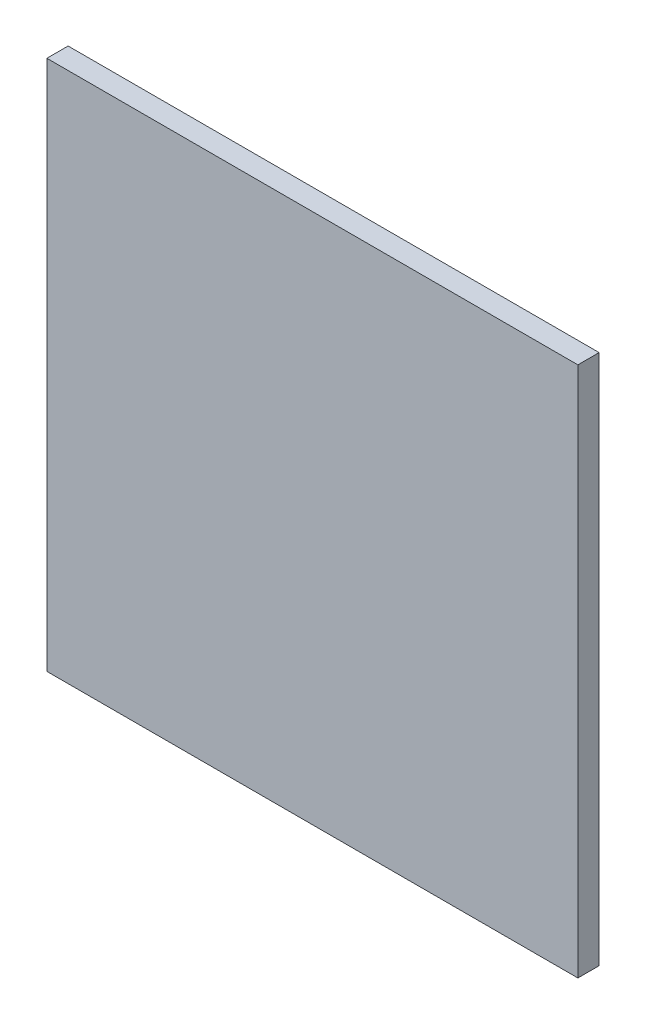
ISO-10303-21;
HEADER;
FILE_DESCRIPTION(('STEP AP214'),'2;1');
FILE_NAME('part.step','',(''),(''),'','','');
FILE_SCHEMA(('AUTOMOTIVE_DESIGN { 1 0 10303 214 1 1 1 1 }'));
ENDSEC;
DATA;
#1=APPLICATION_CONTEXT('core data for automotive mechanical design processes');
#2=APPLICATION_PROTOCOL_DEFINITION('international standard','automotive_design',2000,#1);
#3=PRODUCT_CONTEXT('',#1,'mechanical');
#4=PRODUCT('Part','Part','',(#3));
#5=PRODUCT_RELATED_PRODUCT_CATEGORY('part','',(#4));
#6=PRODUCT_DEFINITION_FORMATION('','',#4);
#7=PRODUCT_DEFINITION_CONTEXT('part definition',#1,'design');
#8=PRODUCT_DEFINITION('design','',#6,#7);
#9=PRODUCT_DEFINITION_SHAPE('','',#8);
#10=(LENGTH_UNIT() NAMED_UNIT(*) SI_UNIT(.MILLI.,.METRE.));
#11=(NAMED_UNIT(*) PLANE_ANGLE_UNIT() SI_UNIT($,.RADIAN.));
#12=(NAMED_UNIT(*) SI_UNIT($,.STERADIAN.) SOLID_ANGLE_UNIT());
#13=UNCERTAINTY_MEASURE_WITH_UNIT(LENGTH_MEASURE(1.E-05),#10,'distance_accuracy_value','');
#14=(GEOMETRIC_REPRESENTATION_CONTEXT(3) GLOBAL_UNCERTAINTY_ASSIGNED_CONTEXT((#13)) GLOBAL_UNIT_ASSIGNED_CONTEXT((#10,
#11,#12)) REPRESENTATION_CONTEXT('',''));
#15=CARTESIAN_POINT('',(0.,0.,0.));
#16=DIRECTION('',(0.,0.,1.));
#17=DIRECTION('',(1.,0.,0.));
#18=AXIS2_PLACEMENT_3D('',#15,#16,#17);
#19=CARTESIAN_POINT('',(37.5,-37.5,3.));
#20=DIRECTION('',(-1.,0.,0.));
#21=DIRECTION('',(0.,0.,1.));
#22=AXIS2_PLACEMENT_3D('',#19,#20,#21);
#23=PLANE('',#22);
#24=DIRECTION('',(0.,1.,0.));
#25=VECTOR('',#24,1.);
#26=CARTESIAN_POINT('',(37.5,-37.5,0.));
#27=LINE('',#26,#25);
#28=CARTESIAN_POINT('',(37.5,-37.5,0.));
#29=VERTEX_POINT('',#28);
#30=CARTESIAN_POINT('',(37.5,37.5,0.));
#31=VERTEX_POINT('',#30);
#32=EDGE_CURVE('E96',#29,#31,#27,.T.);
#33=ORIENTED_EDGE('',*,*,#32,.T.);
#34=DIRECTION('',(0.,0.,-1.));
#35=VECTOR('',#34,1.);
#36=CARTESIAN_POINT('',(37.5,37.5,3.));
#37=LINE('',#36,#35);
#38=CARTESIAN_POINT('',(37.5,37.5,3.));
#39=VERTEX_POINT('',#38);
#40=EDGE_CURVE('E11',#39,#31,#37,.T.);
#41=ORIENTED_EDGE('',*,*,#40,.F.);
#42=DIRECTION('',(0.,1.,0.));
#43=VECTOR('',#42,1.);
#44=CARTESIAN_POINT('',(37.5,-37.5,3.));
#45=LINE('',#44,#43);
#46=CARTESIAN_POINT('',(37.5,-37.5,3.));
#47=VERTEX_POINT('',#46);
#48=EDGE_CURVE('E84',#47,#39,#45,.T.);
#49=ORIENTED_EDGE('',*,*,#48,.F.);
#50=DIRECTION('',(0.,0.,-1.));
#51=VECTOR('',#50,1.);
#52=CARTESIAN_POINT('',(37.5,-37.5,3.));
#53=LINE('',#52,#51);
#54=EDGE_CURVE('E92',#47,#29,#53,.T.);
#55=ORIENTED_EDGE('',*,*,#54,.T.);
#56=EDGE_LOOP('',(#33,#41,#49,#55));
#57=FACE_BOUND('',#56,.T.);
#58=ADVANCED_FACE('F33',(#57),#23,.F.);
#59=CARTESIAN_POINT('',(-37.5,37.5,3.));
#60=DIRECTION('',(0.,-1.,0.));
#61=DIRECTION('',(0.,0.,-1.));
#62=AXIS2_PLACEMENT_3D('',#59,#60,#61);
#63=PLANE('',#62);
#64=DIRECTION('',(-1.,0.,0.));
#65=VECTOR('',#64,1.);
#66=CARTESIAN_POINT('',(-37.5,37.5,0.));
#67=LINE('',#66,#65);
#68=CARTESIAN_POINT('',(-37.5,37.5,0.));
#69=VERTEX_POINT('',#68);
#70=EDGE_CURVE('E88',#31,#69,#67,.T.);
#71=ORIENTED_EDGE('',*,*,#70,.T.);
#72=DIRECTION('',(0.,0.,-1.));
#73=VECTOR('',#72,1.);
#74=CARTESIAN_POINT('',(-37.5,37.5,3.));
#75=LINE('',#74,#73);
#76=CARTESIAN_POINT('',(-37.5,37.5,3.));
#77=VERTEX_POINT('',#76);
#78=EDGE_CURVE('E41',#77,#69,#75,.T.);
#79=ORIENTED_EDGE('',*,*,#78,.F.);
#80=DIRECTION('',(-1.,0.,0.));
#81=VECTOR('',#80,1.);
#82=CARTESIAN_POINT('',(-37.5,37.5,3.));
#83=LINE('',#82,#81);
#84=EDGE_CURVE('E79',#39,#77,#83,.T.);
#85=ORIENTED_EDGE('',*,*,#84,.F.);
#86=ORIENTED_EDGE('',*,*,#40,.T.);
#87=EDGE_LOOP('',(#71,#79,#85,#86));
#88=FACE_BOUND('',#87,.T.);
#89=ADVANCED_FACE('F87',(#88),#63,.F.);
#90=CARTESIAN_POINT('',(-37.5,-37.5,3.));
#91=DIRECTION('',(1.,0.,0.));
#92=DIRECTION('',(0.,0.,-1.));
#93=AXIS2_PLACEMENT_3D('',#90,#91,#92);
#94=PLANE('',#93);
#95=DIRECTION('',(0.,-1.,0.));
#96=VECTOR('',#95,1.);
#97=CARTESIAN_POINT('',(-37.5,-37.5,0.));
#98=LINE('',#97,#96);
#99=CARTESIAN_POINT('',(-37.5,-37.5,0.));
#100=VERTEX_POINT('',#99);
#101=EDGE_CURVE('E66',#69,#100,#98,.T.);
#102=ORIENTED_EDGE('',*,*,#101,.T.);
#103=DIRECTION('',(0.,0.,-1.));
#104=VECTOR('',#103,1.);
#105=CARTESIAN_POINT('',(-37.5,-37.5,3.));
#106=LINE('',#105,#104);
#107=CARTESIAN_POINT('',(-37.5,-37.5,3.));
#108=VERTEX_POINT('',#107);
#109=EDGE_CURVE('E89',#108,#100,#106,.T.);
#110=ORIENTED_EDGE('',*,*,#109,.F.);
#111=DIRECTION('',(0.,-1.,0.));
#112=VECTOR('',#111,1.);
#113=CARTESIAN_POINT('',(-37.5,-37.5,3.));
#114=LINE('',#113,#112);
#115=EDGE_CURVE('E82',#77,#108,#114,.T.);
#116=ORIENTED_EDGE('',*,*,#115,.F.);
#117=ORIENTED_EDGE('',*,*,#78,.T.);
#118=EDGE_LOOP('',(#102,#110,#116,#117));
#119=FACE_BOUND('',#118,.T.);
#120=ADVANCED_FACE('F90',(#119),#94,.F.);
#121=CARTESIAN_POINT('',(-37.5,-37.5,3.));
#122=DIRECTION('',(0.,1.,0.));
#123=DIRECTION('',(0.,0.,1.));
#124=AXIS2_PLACEMENT_3D('',#121,#122,#123);
#125=PLANE('',#124);
#126=DIRECTION('',(1.,0.,0.));
#127=VECTOR('',#126,1.);
#128=CARTESIAN_POINT('',(-37.5,-37.5,0.));
#129=LINE('',#128,#127);
#130=EDGE_CURVE('E72',#100,#29,#129,.T.);
#131=ORIENTED_EDGE('',*,*,#130,.T.);
#132=ORIENTED_EDGE('',*,*,#54,.F.);
#133=DIRECTION('',(1.,0.,0.));
#134=VECTOR('',#133,1.);
#135=CARTESIAN_POINT('',(-37.5,-37.5,3.));
#136=LINE('',#135,#134);
#137=EDGE_CURVE('E49',#108,#47,#136,.T.);
#138=ORIENTED_EDGE('',*,*,#137,.F.);
#139=ORIENTED_EDGE('',*,*,#109,.T.);
#140=EDGE_LOOP('',(#131,#132,#138,#139));
#141=FACE_BOUND('',#140,.T.);
#142=ADVANCED_FACE('F103',(#141),#125,.F.);
#143=CARTESIAN_POINT('',(0.,0.,3.));
#144=DIRECTION('',(0.,0.,-1.));
#145=DIRECTION('',(-1.,0.,0.));
#146=AXIS2_PLACEMENT_3D('',#143,#144,#145);
#147=PLANE('',#146);
#148=ORIENTED_EDGE('',*,*,#48,.T.);
#149=ORIENTED_EDGE('',*,*,#84,.T.);
#150=ORIENTED_EDGE('',*,*,#115,.T.);
#151=ORIENTED_EDGE('',*,*,#137,.T.);
#152=EDGE_LOOP('',(#148,#149,#150,#151));
#153=FACE_BOUND('',#152,.T.);
#154=ADVANCED_FACE('F80',(#153),#147,.F.);
#155=CARTESIAN_POINT('',(0.,0.,0.));
#156=DIRECTION('',(0.,0.,-1.));
#157=DIRECTION('',(-1.,0.,0.));
#158=AXIS2_PLACEMENT_3D('',#155,#156,#157);
#159=PLANE('',#158);
#160=ORIENTED_EDGE('',*,*,#32,.F.);
#161=ORIENTED_EDGE('',*,*,#130,.F.);
#162=ORIENTED_EDGE('',*,*,#101,.F.);
#163=ORIENTED_EDGE('',*,*,#70,.F.);
#164=EDGE_LOOP('',(#160,#161,#162,#163));
#165=FACE_BOUND('',#164,.T.);
#166=ADVANCED_FACE('F106',(#165),#159,.T.);
#167=CLOSED_SHELL('',(#58,#89,#120,#142,#154,#166));
#168=MANIFOLD_SOLID_BREP('B2',#167);
#169=ADVANCED_BREP_SHAPE_REPRESENTATION('',(#18,#168),#14);
#170=SHAPE_DEFINITION_REPRESENTATION(#9,#169);
ENDSEC;
END-ISO-10303-21;
